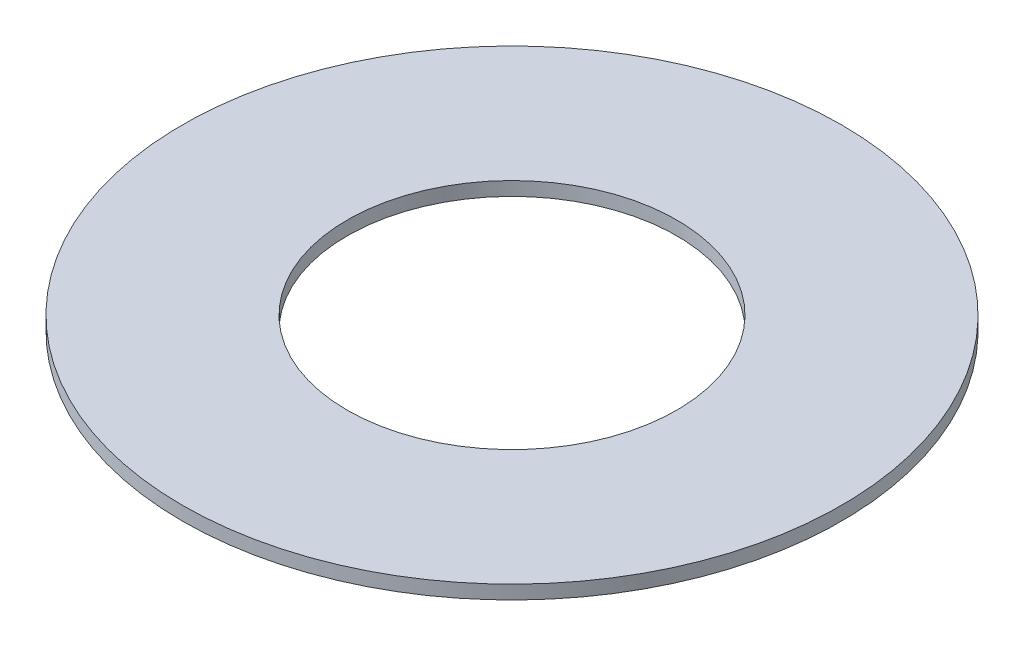
ISO-10303-21;
HEADER;
FILE_DESCRIPTION(('STEP AP214'),'2;1');
FILE_NAME('part.step','',(''),(''),'','','');
FILE_SCHEMA(('AUTOMOTIVE_DESIGN { 1 0 10303 214 1 1 1 1 }'));
ENDSEC;
DATA;
#1=APPLICATION_CONTEXT('core data for automotive mechanical design processes');
#2=APPLICATION_PROTOCOL_DEFINITION('international standard','automotive_design',2000,#1);
#3=PRODUCT_CONTEXT('',#1,'mechanical');
#4=PRODUCT('Part','Part','',(#3));
#5=PRODUCT_RELATED_PRODUCT_CATEGORY('part','',(#4));
#6=PRODUCT_DEFINITION_FORMATION('','',#4);
#7=PRODUCT_DEFINITION_CONTEXT('part definition',#1,'design');
#8=PRODUCT_DEFINITION('design','',#6,#7);
#9=PRODUCT_DEFINITION_SHAPE('','',#8);
#10=(LENGTH_UNIT() NAMED_UNIT(*) SI_UNIT(.MILLI.,.METRE.));
#11=(NAMED_UNIT(*) PLANE_ANGLE_UNIT() SI_UNIT($,.RADIAN.));
#12=(NAMED_UNIT(*) SI_UNIT($,.STERADIAN.) SOLID_ANGLE_UNIT());
#13=UNCERTAINTY_MEASURE_WITH_UNIT(LENGTH_MEASURE(1.E-05),#10,'distance_accuracy_value','');
#14=(GEOMETRIC_REPRESENTATION_CONTEXT(3) GLOBAL_UNCERTAINTY_ASSIGNED_CONTEXT((#13)) GLOBAL_UNIT_ASSIGNED_CONTEXT((#10,
#11,#12)) REPRESENTATION_CONTEXT('',''));
#15=CARTESIAN_POINT('',(0.,0.,0.));
#16=DIRECTION('',(0.,0.,1.));
#17=DIRECTION('',(1.,0.,0.));
#18=AXIS2_PLACEMENT_3D('',#15,#16,#17);
#19=CARTESIAN_POINT('',(0.,0.43,0.));
#20=DIRECTION('',(0.,1.,0.));
#21=DIRECTION('',(0.,0.,1.));
#22=AXIS2_PLACEMENT_3D('',#19,#20,#21);
#23=PLANE('',#22);
#24=CARTESIAN_POINT('',(0.,0.43,0.));
#25=DIRECTION('',(0.,1.,0.));
#26=DIRECTION('',(0.,0.,1.));
#27=AXIS2_PLACEMENT_3D('',#24,#25,#26);
#28=CIRCLE('',#27,10.3124);
#29=CARTESIAN_POINT('',(0.,0.43,10.3124));
#30=VERTEX_POINT('',#29);
#31=EDGE_CURVE('E10',#30,#30,#28,.T.);
#32=ORIENTED_EDGE('',*,*,#31,.T.);
#33=EDGE_LOOP('',(#32));
#34=FACE_BOUND('',#33,.T.);
#35=CARTESIAN_POINT('',(0.,0.43,0.));
#36=DIRECTION('',(0.,1.,0.));
#37=DIRECTION('',(0.,0.,1.));
#38=AXIS2_PLACEMENT_3D('',#35,#36,#37);
#39=CIRCLE('',#38,5.1562);
#40=CARTESIAN_POINT('',(0.,0.43,5.1562));
#41=VERTEX_POINT('',#40);
#42=EDGE_CURVE('E46',#41,#41,#39,.T.);
#43=ORIENTED_EDGE('',*,*,#42,.F.);
#44=EDGE_LOOP('',(#43));
#45=FACE_BOUND('',#44,.T.);
#46=ADVANCED_FACE('F35',(#34,#45),#23,.T.);
#47=CARTESIAN_POINT('',(0.,0.,0.));
#48=DIRECTION('',(0.,1.,0.));
#49=DIRECTION('',(0.,0.,1.));
#50=AXIS2_PLACEMENT_3D('',#47,#48,#49);
#51=PLANE('',#50);
#52=CARTESIAN_POINT('',(0.,0.,0.));
#53=DIRECTION('',(0.,1.,0.));
#54=DIRECTION('',(0.,0.,1.));
#55=AXIS2_PLACEMENT_3D('',#52,#53,#54);
#56=CIRCLE('',#55,10.3124);
#57=CARTESIAN_POINT('',(0.,0.,10.3124));
#58=VERTEX_POINT('',#57);
#59=EDGE_CURVE('E39',#58,#58,#56,.T.);
#60=ORIENTED_EDGE('',*,*,#59,.F.);
#61=EDGE_LOOP('',(#60));
#62=FACE_BOUND('',#61,.T.);
#63=CARTESIAN_POINT('',(0.,0.,0.));
#64=DIRECTION('',(0.,1.,0.));
#65=DIRECTION('',(0.,0.,1.));
#66=AXIS2_PLACEMENT_3D('',#63,#64,#65);
#67=CIRCLE('',#66,5.1562);
#68=CARTESIAN_POINT('',(0.,0.,5.1562));
#69=VERTEX_POINT('',#68);
#70=EDGE_CURVE('E48',#69,#69,#67,.T.);
#71=ORIENTED_EDGE('',*,*,#70,.T.);
#72=EDGE_LOOP('',(#71));
#73=FACE_BOUND('',#72,.T.);
#74=ADVANCED_FACE('F58',(#62,#73),#51,.F.);
#75=CARTESIAN_POINT('',(0.,0.43,0.));
#76=DIRECTION('',(0.,-1.,0.));
#77=DIRECTION('',(0.,0.,-1.));
#78=AXIS2_PLACEMENT_3D('',#75,#76,#77);
#79=CYLINDRICAL_SURFACE('',#78,10.3124);
#80=ORIENTED_EDGE('',*,*,#31,.F.);
#81=EDGE_LOOP('',(#80));
#82=FACE_BOUND('',#81,.T.);
#83=ORIENTED_EDGE('',*,*,#59,.T.);
#84=EDGE_LOOP('',(#83));
#85=FACE_BOUND('',#84,.T.);
#86=ADVANCED_FACE('F37',(#82,#85),#79,.T.);
#87=CARTESIAN_POINT('',(0.,0.43,0.));
#88=DIRECTION('',(0.,-1.,0.));
#89=DIRECTION('',(0.,0.,-1.));
#90=AXIS2_PLACEMENT_3D('',#87,#88,#89);
#91=CYLINDRICAL_SURFACE('',#90,5.1562);
#92=ORIENTED_EDGE('',*,*,#42,.T.);
#93=EDGE_LOOP('',(#92));
#94=FACE_BOUND('',#93,.T.);
#95=ORIENTED_EDGE('',*,*,#70,.F.);
#96=EDGE_LOOP('',(#95));
#97=FACE_BOUND('',#96,.T.);
#98=ADVANCED_FACE('F54',(#94,#97),#91,.F.);
#99=CLOSED_SHELL('',(#46,#74,#86,#98));
#100=MANIFOLD_SOLID_BREP('B2',#99);
#101=ADVANCED_BREP_SHAPE_REPRESENTATION('',(#18,#100),#14);
#102=SHAPE_DEFINITION_REPRESENTATION(#9,#101);
ENDSEC;
END-ISO-10303-21;
